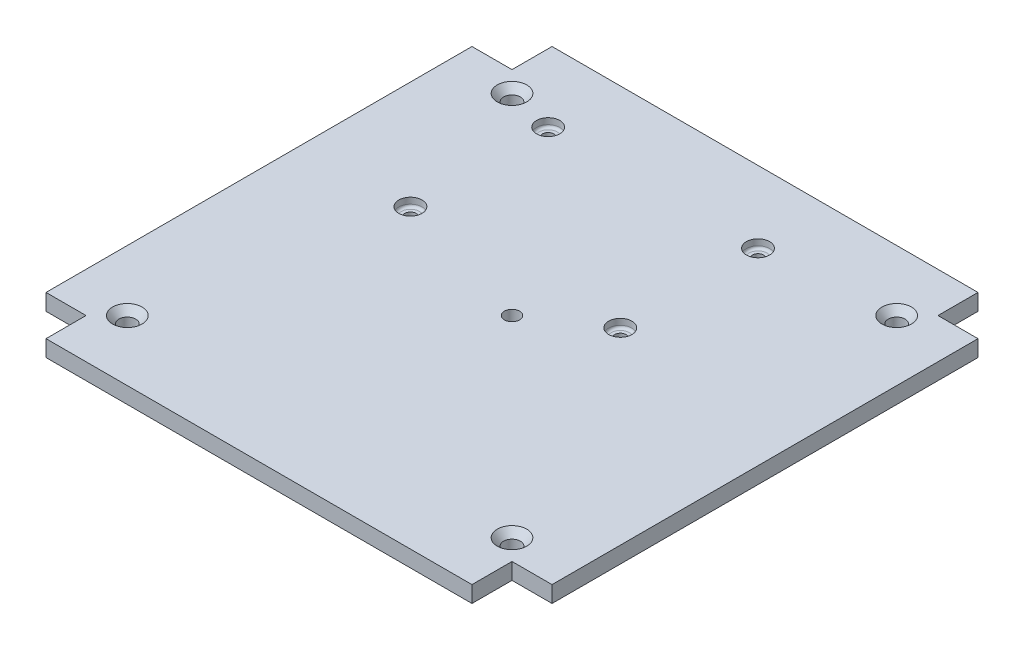
ISO-10303-21;
HEADER;
FILE_DESCRIPTION(('STEP AP214'),'2;1');
FILE_NAME('part.step','',(''),(''),'','','');
FILE_SCHEMA(('AUTOMOTIVE_DESIGN { 1 0 10303 214 1 1 1 1 }'));
ENDSEC;
DATA;
#1=APPLICATION_CONTEXT('core data for automotive mechanical design processes');
#2=APPLICATION_PROTOCOL_DEFINITION('international standard','automotive_design',2000,#1);
#3=PRODUCT_CONTEXT('',#1,'mechanical');
#4=PRODUCT('Part','Part','',(#3));
#5=PRODUCT_RELATED_PRODUCT_CATEGORY('part','',(#4));
#6=PRODUCT_DEFINITION_FORMATION('','',#4);
#7=PRODUCT_DEFINITION_CONTEXT('part definition',#1,'design');
#8=PRODUCT_DEFINITION('design','',#6,#7);
#9=PRODUCT_DEFINITION_SHAPE('','',#8);
#10=(LENGTH_UNIT() NAMED_UNIT(*) SI_UNIT(.MILLI.,.METRE.));
#11=(NAMED_UNIT(*) PLANE_ANGLE_UNIT() SI_UNIT($,.RADIAN.));
#12=(NAMED_UNIT(*) SI_UNIT($,.STERADIAN.) SOLID_ANGLE_UNIT());
#13=UNCERTAINTY_MEASURE_WITH_UNIT(LENGTH_MEASURE(1.E-05),#10,'distance_accuracy_value','');
#14=(GEOMETRIC_REPRESENTATION_CONTEXT(3) GLOBAL_UNCERTAINTY_ASSIGNED_CONTEXT((#13)) GLOBAL_UNIT_ASSIGNED_CONTEXT((#10,
#11,#12)) REPRESENTATION_CONTEXT('',''));
#15=CARTESIAN_POINT('',(0.,0.,0.));
#16=DIRECTION('',(0.,0.,1.));
#17=DIRECTION('',(1.,0.,0.));
#18=AXIS2_PLACEMENT_3D('',#15,#16,#17);
#19=CARTESIAN_POINT('',(49.,3.175,49.));
#20=DIRECTION('',(-1.,0.,0.));
#21=DIRECTION('',(0.,0.,1.));
#22=AXIS2_PLACEMENT_3D('',#19,#20,#21);
#23=PLANE('',#22);
#24=DIRECTION('',(0.,0.,-1.));
#25=VECTOR('',#24,1.);
#26=CARTESIAN_POINT('',(49.,0.,49.));
#27=LINE('',#26,#25);
#28=CARTESIAN_POINT('',(49.,0.,41.246));
#29=VERTEX_POINT('',#28);
#30=CARTESIAN_POINT('',(49.,0.,-41.246));
#31=VERTEX_POINT('',#30);
#32=EDGE_CURVE('E156',#29,#31,#27,.T.);
#33=ORIENTED_EDGE('',*,*,#32,.T.);
#34=DIRECTION('',(0.,1.,0.));
#35=VECTOR('',#34,1.);
#36=CARTESIAN_POINT('',(49.,0.,-41.246));
#37=LINE('',#36,#35);
#38=CARTESIAN_POINT('',(49.,3.175,-41.246));
#39=VERTEX_POINT('',#38);
#40=EDGE_CURVE('E673',#31,#39,#37,.T.);
#41=ORIENTED_EDGE('',*,*,#40,.T.);
#42=DIRECTION('',(0.,0.,-1.));
#43=VECTOR('',#42,1.);
#44=CARTESIAN_POINT('',(49.,3.175,49.));
#45=LINE('',#44,#43);
#46=CARTESIAN_POINT('',(49.,3.175,41.246));
#47=VERTEX_POINT('',#46);
#48=EDGE_CURVE('E168',#47,#39,#45,.T.);
#49=ORIENTED_EDGE('',*,*,#48,.F.);
#50=DIRECTION('',(0.,1.,0.));
#51=VECTOR('',#50,1.);
#52=CARTESIAN_POINT('',(49.,0.,41.246));
#53=LINE('',#52,#51);
#54=EDGE_CURVE('E307',#29,#47,#53,.T.);
#55=ORIENTED_EDGE('',*,*,#54,.F.);
#56=EDGE_LOOP('',(#33,#41,#49,#55));
#57=FACE_BOUND('',#56,.T.);
#58=ADVANCED_FACE('F43',(#57),#23,.F.);
#59=CARTESIAN_POINT('',(-49.,3.175,-49.));
#60=DIRECTION('',(0.,0.,1.));
#61=DIRECTION('',(1.,0.,0.));
#62=AXIS2_PLACEMENT_3D('',#59,#60,#61);
#63=PLANE('',#62);
#64=DIRECTION('',(-1.,0.,0.));
#65=VECTOR('',#64,1.);
#66=CARTESIAN_POINT('',(-49.,3.175,-49.));
#67=LINE('',#66,#65);
#68=CARTESIAN_POINT('',(41.246,3.175,-49.));
#69=VERTEX_POINT('',#68);
#70=CARTESIAN_POINT('',(-41.246,3.175,-49.));
#71=VERTEX_POINT('',#70);
#72=EDGE_CURVE('E148',#69,#71,#67,.T.);
#73=ORIENTED_EDGE('',*,*,#72,.F.);
#74=DIRECTION('',(0.,1.,0.));
#75=VECTOR('',#74,1.);
#76=CARTESIAN_POINT('',(41.246,0.,-49.));
#77=LINE('',#76,#75);
#78=CARTESIAN_POINT('',(41.246,0.,-49.));
#79=VERTEX_POINT('',#78);
#80=EDGE_CURVE('E135',#79,#69,#77,.T.);
#81=ORIENTED_EDGE('',*,*,#80,.F.);
#82=DIRECTION('',(-1.,0.,0.));
#83=VECTOR('',#82,1.);
#84=CARTESIAN_POINT('',(-49.,0.,-49.));
#85=LINE('',#84,#83);
#86=CARTESIAN_POINT('',(-41.246,0.,-49.));
#87=VERTEX_POINT('',#86);
#88=EDGE_CURVE('E146',#79,#87,#85,.T.);
#89=ORIENTED_EDGE('',*,*,#88,.T.);
#90=DIRECTION('',(0.,1.,0.));
#91=VECTOR('',#90,1.);
#92=CARTESIAN_POINT('',(-41.246,0.,-49.));
#93=LINE('',#92,#91);
#94=EDGE_CURVE('E336',#87,#71,#93,.T.);
#95=ORIENTED_EDGE('',*,*,#94,.T.);
#96=EDGE_LOOP('',(#73,#81,#89,#95));
#97=FACE_BOUND('',#96,.T.);
#98=ADVANCED_FACE('F144',(#97),#63,.F.);
#99=CARTESIAN_POINT('',(-49.,3.175,49.));
#100=DIRECTION('',(1.,0.,0.));
#101=DIRECTION('',(0.,0.,-1.));
#102=AXIS2_PLACEMENT_3D('',#99,#100,#101);
#103=PLANE('',#102);
#104=DIRECTION('',(0.,0.,1.));
#105=VECTOR('',#104,1.);
#106=CARTESIAN_POINT('',(-49.,0.,49.));
#107=LINE('',#106,#105);
#108=CARTESIAN_POINT('',(-49.,0.,-41.246));
#109=VERTEX_POINT('',#108);
#110=CARTESIAN_POINT('',(-49.,0.,41.246));
#111=VERTEX_POINT('',#110);
#112=EDGE_CURVE('E155',#109,#111,#107,.T.);
#113=ORIENTED_EDGE('',*,*,#112,.T.);
#114=DIRECTION('',(0.,1.,0.));
#115=VECTOR('',#114,1.);
#116=CARTESIAN_POINT('',(-49.,0.,41.246));
#117=LINE('',#116,#115);
#118=CARTESIAN_POINT('',(-49.,3.175,41.246));
#119=VERTEX_POINT('',#118);
#120=EDGE_CURVE('E320',#111,#119,#117,.T.);
#121=ORIENTED_EDGE('',*,*,#120,.T.);
#122=DIRECTION('',(0.,0.,1.));
#123=VECTOR('',#122,1.);
#124=CARTESIAN_POINT('',(-49.,3.175,49.));
#125=LINE('',#124,#123);
#126=CARTESIAN_POINT('',(-49.,3.175,-41.246));
#127=VERTEX_POINT('',#126);
#128=EDGE_CURVE('E283',#127,#119,#125,.T.);
#129=ORIENTED_EDGE('',*,*,#128,.F.);
#130=DIRECTION('',(0.,1.,0.));
#131=VECTOR('',#130,1.);
#132=CARTESIAN_POINT('',(-49.,0.,-41.246));
#133=LINE('',#132,#131);
#134=EDGE_CURVE('E331',#109,#127,#133,.T.);
#135=ORIENTED_EDGE('',*,*,#134,.F.);
#136=EDGE_LOOP('',(#113,#121,#129,#135));
#137=FACE_BOUND('',#136,.T.);
#138=ADVANCED_FACE('F229',(#137),#103,.F.);
#139=CARTESIAN_POINT('',(-49.,3.175,49.));
#140=DIRECTION('',(0.,0.,-1.));
#141=DIRECTION('',(-1.,0.,0.));
#142=AXIS2_PLACEMENT_3D('',#139,#140,#141);
#143=PLANE('',#142);
#144=DIRECTION('',(1.,0.,0.));
#145=VECTOR('',#144,1.);
#146=CARTESIAN_POINT('',(-49.,0.,49.));
#147=LINE('',#146,#145);
#148=CARTESIAN_POINT('',(-41.246,0.,49.));
#149=VERTEX_POINT('',#148);
#150=CARTESIAN_POINT('',(41.246,0.,49.));
#151=VERTEX_POINT('',#150);
#152=EDGE_CURVE('E159',#149,#151,#147,.T.);
#153=ORIENTED_EDGE('',*,*,#152,.T.);
#154=DIRECTION('',(0.,1.,0.));
#155=VECTOR('',#154,1.);
#156=CARTESIAN_POINT('',(41.246,0.,49.));
#157=LINE('',#156,#155);
#158=CARTESIAN_POINT('',(41.246,3.175,49.));
#159=VERTEX_POINT('',#158);
#160=EDGE_CURVE('E302',#151,#159,#157,.T.);
#161=ORIENTED_EDGE('',*,*,#160,.T.);
#162=DIRECTION('',(1.,0.,0.));
#163=VECTOR('',#162,1.);
#164=CARTESIAN_POINT('',(-49.,3.175,49.));
#165=LINE('',#164,#163);
#166=CARTESIAN_POINT('',(-41.246,3.175,49.));
#167=VERTEX_POINT('',#166);
#168=EDGE_CURVE('E192',#167,#159,#165,.T.);
#169=ORIENTED_EDGE('',*,*,#168,.F.);
#170=DIRECTION('',(0.,1.,0.));
#171=VECTOR('',#170,1.);
#172=CARTESIAN_POINT('',(-41.246,0.,49.));
#173=LINE('',#172,#171);
#174=EDGE_CURVE('E300',#149,#167,#173,.T.);
#175=ORIENTED_EDGE('',*,*,#174,.F.);
#176=EDGE_LOOP('',(#153,#161,#169,#175));
#177=FACE_BOUND('',#176,.T.);
#178=ADVANCED_FACE('F299',(#177),#143,.F.);
#179=CARTESIAN_POINT('',(0.,3.175,0.));
#180=DIRECTION('',(0.,-1.,0.));
#181=DIRECTION('',(0.,0.,-1.));
#182=AXIS2_PLACEMENT_3D('',#179,#180,#181);
#183=PLANE('',#182);
#184=CARTESIAN_POINT('',(-28.095,3.175,-8.425));
#185=DIRECTION('',(0.,1.,0.));
#186=DIRECTION('',(0.,0.,1.));
#187=AXIS2_PLACEMENT_3D('',#184,#185,#186);
#188=CIRCLE('',#187,2.25);
#189=CARTESIAN_POINT('',(-28.095,3.175,-6.175));
#190=VERTEX_POINT('',#189);
#191=EDGE_CURVE('E186',#190,#190,#188,.T.);
#192=ORIENTED_EDGE('',*,*,#191,.F.);
#193=EDGE_LOOP('',(#192));
#194=FACE_BOUND('',#193,.T.);
#195=CARTESIAN_POINT('',(12.545,3.175,-8.425));
#196=DIRECTION('',(0.,1.,0.));
#197=DIRECTION('',(0.,0.,1.));
#198=AXIS2_PLACEMENT_3D('',#195,#196,#197);
#199=CIRCLE('',#198,2.25);
#200=CARTESIAN_POINT('',(12.545,3.175,-6.175));
#201=VERTEX_POINT('',#200);
#202=EDGE_CURVE('E181',#201,#201,#199,.T.);
#203=ORIENTED_EDGE('',*,*,#202,.F.);
#204=EDGE_LOOP('',(#203));
#205=FACE_BOUND('',#204,.T.);
#206=CARTESIAN_POINT('',(12.545,3.175,-35.095));
#207=DIRECTION('',(0.,1.,0.));
#208=DIRECTION('',(0.,0.,1.));
#209=AXIS2_PLACEMENT_3D('',#206,#207,#208);
#210=CIRCLE('',#209,2.25);
#211=CARTESIAN_POINT('',(12.545,3.175,-32.845));
#212=VERTEX_POINT('',#211);
#213=EDGE_CURVE('E177',#212,#212,#210,.T.);
#214=ORIENTED_EDGE('',*,*,#213,.F.);
#215=EDGE_LOOP('',(#214));
#216=FACE_BOUND('',#215,.T.);
#217=CARTESIAN_POINT('',(-28.095,3.175,-35.095));
#218=DIRECTION('',(0.,1.,0.));
#219=DIRECTION('',(0.,0.,1.));
#220=AXIS2_PLACEMENT_3D('',#217,#218,#219);
#221=CIRCLE('',#220,2.25);
#222=CARTESIAN_POINT('',(-28.095,3.175,-32.845));
#223=VERTEX_POINT('',#222);
#224=EDGE_CURVE('E173',#223,#223,#221,.T.);
#225=ORIENTED_EDGE('',*,*,#224,.F.);
#226=EDGE_LOOP('',(#225));
#227=FACE_BOUND('',#226,.T.);
#228=CARTESIAN_POINT('',(37.2500000000016,3.175,37.250000000002));
#229=DIRECTION('',(0.,1.,0.));
#230=DIRECTION('',(0.,0.,1.));
#231=AXIS2_PLACEMENT_3D('',#228,#229,#230);
#232=CIRCLE('',#231,2.8575);
#233=CARTESIAN_POINT('',(37.2500000000016,3.175,40.107500000002));
#234=VERTEX_POINT('',#233);
#235=EDGE_CURVE('E338',#234,#234,#232,.T.);
#236=ORIENTED_EDGE('',*,*,#235,.F.);
#237=EDGE_LOOP('',(#236));
#238=FACE_BOUND('',#237,.T.);
#239=CARTESIAN_POINT('',(-37.2499999999981,3.175,37.2500000000024));
#240=DIRECTION('',(0.,1.,0.));
#241=DIRECTION('',(0.,0.,1.));
#242=AXIS2_PLACEMENT_3D('',#239,#240,#241);
#243=CIRCLE('',#242,2.8575);
#244=CARTESIAN_POINT('',(-37.2499999999981,3.175,40.1075000000024));
#245=VERTEX_POINT('',#244);
#246=EDGE_CURVE('E350',#245,#245,#243,.T.);
#247=ORIENTED_EDGE('',*,*,#246,.F.);
#248=EDGE_LOOP('',(#247));
#249=FACE_BOUND('',#248,.T.);
#250=CARTESIAN_POINT('',(-37.2499999999987,3.175,-37.2499999999978));
#251=DIRECTION('',(0.,1.,0.));
#252=DIRECTION('',(0.,0.,1.));
#253=AXIS2_PLACEMENT_3D('',#250,#251,#252);
#254=CIRCLE('',#253,2.8575);
#255=CARTESIAN_POINT('',(-37.2499999999987,3.175,-34.3924999999978));
#256=VERTEX_POINT('',#255);
#257=EDGE_CURVE('E359',#256,#256,#254,.T.);
#258=ORIENTED_EDGE('',*,*,#257,.F.);
#259=EDGE_LOOP('',(#258));
#260=FACE_BOUND('',#259,.T.);
#261=CARTESIAN_POINT('',(37.2499999999997,3.175,-37.2499999999999));
#262=DIRECTION('',(0.,1.,0.));
#263=DIRECTION('',(0.,0.,1.));
#264=AXIS2_PLACEMENT_3D('',#261,#262,#263);
#265=CIRCLE('',#264,2.8575);
#266=CARTESIAN_POINT('',(37.2499999999997,3.175,-34.3924999999999));
#267=VERTEX_POINT('',#266);
#268=EDGE_CURVE('E368',#267,#267,#265,.T.);
#269=ORIENTED_EDGE('',*,*,#268,.F.);
#270=EDGE_LOOP('',(#269));
#271=FACE_BOUND('',#270,.T.);
#272=CARTESIAN_POINT('',(0.,3.175,0.));
#273=DIRECTION('',(0.,1.,0.));
#274=DIRECTION('',(0.,0.,1.));
#275=AXIS2_PLACEMENT_3D('',#272,#273,#274);
#276=CIRCLE('',#275,1.47319999999999);
#277=CARTESIAN_POINT('',(0.,3.175,1.47319999999999));
#278=VERTEX_POINT('',#277);
#279=EDGE_CURVE('E269',#278,#278,#276,.T.);
#280=ORIENTED_EDGE('',*,*,#279,.F.);
#281=EDGE_LOOP('',(#280));
#282=FACE_BOUND('',#281,.T.);
#283=ORIENTED_EDGE('',*,*,#48,.T.);
#284=DIRECTION('',(1.,0.,0.));
#285=VECTOR('',#284,1.);
#286=CARTESIAN_POINT('',(49.,3.175,-41.246));
#287=LINE('',#286,#285);
#288=CARTESIAN_POINT('',(41.246,3.175,-41.246));
#289=VERTEX_POINT('',#288);
#290=EDGE_CURVE('E140',#289,#39,#287,.T.);
#291=ORIENTED_EDGE('',*,*,#290,.F.);
#292=DIRECTION('',(0.,0.,1.));
#293=VECTOR('',#292,1.);
#294=CARTESIAN_POINT('',(41.246,3.175,-41.246));
#295=LINE('',#294,#293);
#296=EDGE_CURVE('E172',#69,#289,#295,.T.);
#297=ORIENTED_EDGE('',*,*,#296,.F.);
#298=ORIENTED_EDGE('',*,*,#72,.T.);
#299=DIRECTION('',(0.,0.,-1.));
#300=VECTOR('',#299,1.);
#301=CARTESIAN_POINT('',(-41.246,3.175,-49.));
#302=LINE('',#301,#300);
#303=CARTESIAN_POINT('',(-41.246,3.175,-41.246));
#304=VERTEX_POINT('',#303);
#305=EDGE_CURVE('E329',#304,#71,#302,.T.);
#306=ORIENTED_EDGE('',*,*,#305,.F.);
#307=DIRECTION('',(1.,0.,0.));
#308=VECTOR('',#307,1.);
#309=CARTESIAN_POINT('',(-41.246,3.175,-41.246));
#310=LINE('',#309,#308);
#311=EDGE_CURVE('E323',#127,#304,#310,.T.);
#312=ORIENTED_EDGE('',*,*,#311,.F.);
#313=ORIENTED_EDGE('',*,*,#128,.T.);
#314=DIRECTION('',(-1.,0.,0.));
#315=VECTOR('',#314,1.);
#316=CARTESIAN_POINT('',(-49.,3.175,41.246));
#317=LINE('',#316,#315);
#318=CARTESIAN_POINT('',(-41.246,3.175,41.246));
#319=VERTEX_POINT('',#318);
#320=EDGE_CURVE('E305',#319,#119,#317,.T.);
#321=ORIENTED_EDGE('',*,*,#320,.F.);
#322=DIRECTION('',(0.,0.,-1.));
#323=VECTOR('',#322,1.);
#324=CARTESIAN_POINT('',(-41.246,3.175,41.246));
#325=LINE('',#324,#323);
#326=EDGE_CURVE('E295',#167,#319,#325,.T.);
#327=ORIENTED_EDGE('',*,*,#326,.F.);
#328=ORIENTED_EDGE('',*,*,#168,.T.);
#329=DIRECTION('',(0.,0.,1.));
#330=VECTOR('',#329,1.);
#331=CARTESIAN_POINT('',(41.246,3.175,49.));
#332=LINE('',#331,#330);
#333=CARTESIAN_POINT('',(41.246,3.175,41.246));
#334=VERTEX_POINT('',#333);
#335=EDGE_CURVE('E292',#334,#159,#332,.T.);
#336=ORIENTED_EDGE('',*,*,#335,.F.);
#337=DIRECTION('',(-1.,0.,0.));
#338=VECTOR('',#337,1.);
#339=CARTESIAN_POINT('',(41.246,3.175,41.246));
#340=LINE('',#339,#338);
#341=EDGE_CURVE('E676',#47,#334,#340,.T.);
#342=ORIENTED_EDGE('',*,*,#341,.F.);
#343=EDGE_LOOP('',(#283,#291,#297,#298,#306,#312,#313,#321,#327,#328,#336,#342));
#344=FACE_BOUND('',#343,.T.);
#345=ADVANCED_FACE('F290',(#194,#205,#216,#227,#238,#249,#260,#271,#282,#344),#183,.F.);
#346=CARTESIAN_POINT('',(0.,0.,0.));
#347=DIRECTION('',(0.,-1.,0.));
#348=DIRECTION('',(0.,0.,-1.));
#349=AXIS2_PLACEMENT_3D('',#346,#347,#348);
#350=PLANE('',#349);
#351=DIRECTION('',(1.,0.,0.));
#352=VECTOR('',#351,1.);
#353=CARTESIAN_POINT('',(49.,0.,-41.246));
#354=LINE('',#353,#352);
#355=CARTESIAN_POINT('',(41.246,0.,-41.246));
#356=VERTEX_POINT('',#355);
#357=EDGE_CURVE('E58',#356,#31,#354,.T.);
#358=ORIENTED_EDGE('',*,*,#357,.T.);
#359=ORIENTED_EDGE('',*,*,#32,.F.);
#360=DIRECTION('',(-1.,0.,0.));
#361=VECTOR('',#360,1.);
#362=CARTESIAN_POINT('',(41.246,0.,41.246));
#363=LINE('',#362,#361);
#364=CARTESIAN_POINT('',(41.246,0.,41.246));
#365=VERTEX_POINT('',#364);
#366=EDGE_CURVE('E678',#29,#365,#363,.T.);
#367=ORIENTED_EDGE('',*,*,#366,.T.);
#368=DIRECTION('',(0.,0.,1.));
#369=VECTOR('',#368,1.);
#370=CARTESIAN_POINT('',(41.246,0.,49.));
#371=LINE('',#370,#369);
#372=EDGE_CURVE('E66',#365,#151,#371,.T.);
#373=ORIENTED_EDGE('',*,*,#372,.T.);
#374=ORIENTED_EDGE('',*,*,#152,.F.);
#375=DIRECTION('',(0.,0.,-1.));
#376=VECTOR('',#375,1.);
#377=CARTESIAN_POINT('',(-41.246,0.,41.246));
#378=LINE('',#377,#376);
#379=CARTESIAN_POINT('',(-41.246,0.,41.246));
#380=VERTEX_POINT('',#379);
#381=EDGE_CURVE('E313',#149,#380,#378,.T.);
#382=ORIENTED_EDGE('',*,*,#381,.T.);
#383=DIRECTION('',(-1.,0.,0.));
#384=VECTOR('',#383,1.);
#385=CARTESIAN_POINT('',(-49.,0.,41.246));
#386=LINE('',#385,#384);
#387=EDGE_CURVE('E316',#380,#111,#386,.T.);
#388=ORIENTED_EDGE('',*,*,#387,.T.);
#389=ORIENTED_EDGE('',*,*,#112,.F.);
#390=DIRECTION('',(1.,0.,0.));
#391=VECTOR('',#390,1.);
#392=CARTESIAN_POINT('',(-41.246,0.,-41.246));
#393=LINE('',#392,#391);
#394=CARTESIAN_POINT('',(-41.246,0.,-41.246));
#395=VERTEX_POINT('',#394);
#396=EDGE_CURVE('E327',#109,#395,#393,.T.);
#397=ORIENTED_EDGE('',*,*,#396,.T.);
#398=DIRECTION('',(0.,0.,-1.));
#399=VECTOR('',#398,1.);
#400=CARTESIAN_POINT('',(-41.246,0.,-49.));
#401=LINE('',#400,#399);
#402=EDGE_CURVE('E154',#395,#87,#401,.T.);
#403=ORIENTED_EDGE('',*,*,#402,.T.);
#404=ORIENTED_EDGE('',*,*,#88,.F.);
#405=DIRECTION('',(0.,0.,1.));
#406=VECTOR('',#405,1.);
#407=CARTESIAN_POINT('',(41.246,0.,-41.246));
#408=LINE('',#407,#406);
#409=EDGE_CURVE('E131',#79,#356,#408,.T.);
#410=ORIENTED_EDGE('',*,*,#409,.T.);
#411=EDGE_LOOP('',(#358,#359,#367,#373,#374,#382,#388,#389,#397,#403,#404,#410));
#412=FACE_BOUND('',#411,.T.);
#413=CARTESIAN_POINT('',(37.2500000000016,0.,37.250000000002));
#414=DIRECTION('',(0.,1.,0.));
#415=DIRECTION('',(0.,0.,1.));
#416=AXIS2_PLACEMENT_3D('',#413,#414,#415);
#417=CIRCLE('',#416,1.63195);
#418=CARTESIAN_POINT('',(37.2500000000016,0.,38.881950000002));
#419=VERTEX_POINT('',#418);
#420=EDGE_CURVE('E347',#419,#419,#417,.T.);
#421=ORIENTED_EDGE('',*,*,#420,.T.);
#422=EDGE_LOOP('',(#421));
#423=FACE_BOUND('',#422,.T.);
#424=CARTESIAN_POINT('',(-37.2499999999981,0.,37.2500000000024));
#425=DIRECTION('',(0.,1.,0.));
#426=DIRECTION('',(0.,0.,1.));
#427=AXIS2_PLACEMENT_3D('',#424,#425,#426);
#428=CIRCLE('',#427,1.63195);
#429=CARTESIAN_POINT('',(-37.2499999999981,0.,38.8819500000024));
#430=VERTEX_POINT('',#429);
#431=EDGE_CURVE('E356',#430,#430,#428,.T.);
#432=ORIENTED_EDGE('',*,*,#431,.T.);
#433=EDGE_LOOP('',(#432));
#434=FACE_BOUND('',#433,.T.);
#435=CARTESIAN_POINT('',(-37.2499999999987,0.,-37.2499999999978));
#436=DIRECTION('',(0.,1.,0.));
#437=DIRECTION('',(0.,0.,1.));
#438=AXIS2_PLACEMENT_3D('',#435,#436,#437);
#439=CIRCLE('',#438,1.63195);
#440=CARTESIAN_POINT('',(-37.2499999999987,0.,-35.6180499999978));
#441=VERTEX_POINT('',#440);
#442=EDGE_CURVE('E365',#441,#441,#439,.T.);
#443=ORIENTED_EDGE('',*,*,#442,.T.);
#444=EDGE_LOOP('',(#443));
#445=FACE_BOUND('',#444,.T.);
#446=CARTESIAN_POINT('',(37.2499999999997,0.,-37.2499999999999));
#447=DIRECTION('',(0.,1.,0.));
#448=DIRECTION('',(0.,0.,1.));
#449=AXIS2_PLACEMENT_3D('',#446,#447,#448);
#450=CIRCLE('',#449,1.63195);
#451=CARTESIAN_POINT('',(37.2499999999997,0.,-35.6180499999999));
#452=VERTEX_POINT('',#451);
#453=EDGE_CURVE('E374',#452,#452,#450,.T.);
#454=ORIENTED_EDGE('',*,*,#453,.T.);
#455=EDGE_LOOP('',(#454));
#456=FACE_BOUND('',#455,.T.);
#457=CARTESIAN_POINT('',(-28.095,0.,-35.095));
#458=DIRECTION('',(0.,1.,0.));
#459=DIRECTION('',(0.,0.,1.));
#460=AXIS2_PLACEMENT_3D('',#457,#458,#459);
#461=CIRCLE('',#460,1.1);
#462=CARTESIAN_POINT('',(-28.095,0.,-33.995));
#463=VERTEX_POINT('',#462);
#464=EDGE_CURVE('E272',#463,#463,#461,.T.);
#465=ORIENTED_EDGE('',*,*,#464,.T.);
#466=EDGE_LOOP('',(#465));
#467=FACE_BOUND('',#466,.T.);
#468=CARTESIAN_POINT('',(12.545,0.,-35.095));
#469=DIRECTION('',(0.,1.,0.));
#470=DIRECTION('',(0.,0.,1.));
#471=AXIS2_PLACEMENT_3D('',#468,#469,#470);
#472=CIRCLE('',#471,1.1);
#473=CARTESIAN_POINT('',(12.545,0.,-33.995));
#474=VERTEX_POINT('',#473);
#475=EDGE_CURVE('E265',#474,#474,#472,.T.);
#476=ORIENTED_EDGE('',*,*,#475,.T.);
#477=EDGE_LOOP('',(#476));
#478=FACE_BOUND('',#477,.T.);
#479=CARTESIAN_POINT('',(12.545,0.,-8.425));
#480=DIRECTION('',(0.,1.,0.));
#481=DIRECTION('',(0.,0.,1.));
#482=AXIS2_PLACEMENT_3D('',#479,#480,#481);
#483=CIRCLE('',#482,1.1);
#484=CARTESIAN_POINT('',(12.545,0.,-7.325));
#485=VERTEX_POINT('',#484);
#486=EDGE_CURVE('E262',#485,#485,#483,.T.);
#487=ORIENTED_EDGE('',*,*,#486,.T.);
#488=EDGE_LOOP('',(#487));
#489=FACE_BOUND('',#488,.T.);
#490=CARTESIAN_POINT('',(-28.095,0.,-8.425));
#491=DIRECTION('',(0.,1.,0.));
#492=DIRECTION('',(0.,0.,1.));
#493=AXIS2_PLACEMENT_3D('',#490,#491,#492);
#494=CIRCLE('',#493,1.1);
#495=CARTESIAN_POINT('',(-28.095,0.,-7.325));
#496=VERTEX_POINT('',#495);
#497=EDGE_CURVE('E264',#496,#496,#494,.T.);
#498=ORIENTED_EDGE('',*,*,#497,.T.);
#499=EDGE_LOOP('',(#498));
#500=FACE_BOUND('',#499,.T.);
#501=CARTESIAN_POINT('',(0.,0.,0.));
#502=DIRECTION('',(0.,1.,0.));
#503=DIRECTION('',(0.,0.,1.));
#504=AXIS2_PLACEMENT_3D('',#501,#502,#503);
#505=CIRCLE('',#504,1.4732);
#506=CARTESIAN_POINT('',(0.,0.,1.4732));
#507=VERTEX_POINT('',#506);
#508=EDGE_CURVE('E162',#507,#507,#505,.T.);
#509=ORIENTED_EDGE('',*,*,#508,.T.);
#510=EDGE_LOOP('',(#509));
#511=FACE_BOUND('',#510,.T.);
#512=ADVANCED_FACE('F151',(#412,#423,#434,#445,#456,#467,#478,#489,#500,#511),#350,.T.);
#513=CARTESIAN_POINT('',(0.,3.175,0.));
#514=DIRECTION('',(0.,1.,0.));
#515=DIRECTION('',(0.,0.,1.));
#516=AXIS2_PLACEMENT_3D('',#513,#514,#515);
#517=CYLINDRICAL_SURFACE('',#516,1.47319999999999);
#518=ORIENTED_EDGE('',*,*,#508,.F.);
#519=EDGE_LOOP('',(#518));
#520=FACE_BOUND('',#519,.T.);
#521=ORIENTED_EDGE('',*,*,#279,.T.);
#522=EDGE_LOOP('',(#521));
#523=FACE_BOUND('',#522,.T.);
#524=ADVANCED_FACE('F400',(#520,#523),#517,.F.);
#525=CARTESIAN_POINT('',(-28.095,3.175,-8.425));
#526=DIRECTION('',(0.,1.,0.));
#527=DIRECTION('',(0.,0.,1.));
#528=AXIS2_PLACEMENT_3D('',#525,#526,#527);
#529=CYLINDRICAL_SURFACE('',#528,1.1);
#530=CARTESIAN_POINT('',(-28.095,1.5,-8.425));
#531=DIRECTION('',(0.,-1.,0.));
#532=DIRECTION('',(0.,0.,-1.));
#533=AXIS2_PLACEMENT_3D('',#530,#531,#532);
#534=CIRCLE('',#533,1.1);
#535=CARTESIAN_POINT('',(-28.095,1.5,-9.525));
#536=VERTEX_POINT('',#535);
#537=EDGE_CURVE('E182',#536,#536,#534,.F.);
#538=ORIENTED_EDGE('',*,*,#537,.T.);
#539=EDGE_LOOP('',(#538));
#540=FACE_BOUND('',#539,.T.);
#541=ORIENTED_EDGE('',*,*,#497,.F.);
#542=EDGE_LOOP('',(#541));
#543=FACE_BOUND('',#542,.T.);
#544=ADVANCED_FACE('F258',(#540,#543),#529,.F.);
#545=CARTESIAN_POINT('',(12.545,3.175,-8.425));
#546=DIRECTION('',(0.,1.,0.));
#547=DIRECTION('',(0.,0.,1.));
#548=AXIS2_PLACEMENT_3D('',#545,#546,#547);
#549=CYLINDRICAL_SURFACE('',#548,1.1);
#550=CARTESIAN_POINT('',(12.545,1.5,-8.425));
#551=DIRECTION('',(0.,-1.,0.));
#552=DIRECTION('',(0.,0.,-1.));
#553=AXIS2_PLACEMENT_3D('',#550,#551,#552);
#554=CIRCLE('',#553,1.1);
#555=CARTESIAN_POINT('',(12.545,1.5,-9.525));
#556=VERTEX_POINT('',#555);
#557=EDGE_CURVE('E178',#556,#556,#554,.F.);
#558=ORIENTED_EDGE('',*,*,#557,.T.);
#559=EDGE_LOOP('',(#558));
#560=FACE_BOUND('',#559,.T.);
#561=ORIENTED_EDGE('',*,*,#486,.F.);
#562=EDGE_LOOP('',(#561));
#563=FACE_BOUND('',#562,.T.);
#564=ADVANCED_FACE('F254',(#560,#563),#549,.F.);
#565=CARTESIAN_POINT('',(12.545,3.175,-35.095));
#566=DIRECTION('',(0.,1.,0.));
#567=DIRECTION('',(0.,0.,1.));
#568=AXIS2_PLACEMENT_3D('',#565,#566,#567);
#569=CYLINDRICAL_SURFACE('',#568,1.1);
#570=CARTESIAN_POINT('',(12.545,1.5,-35.095));
#571=DIRECTION('',(0.,-1.,0.));
#572=DIRECTION('',(0.,0.,-1.));
#573=AXIS2_PLACEMENT_3D('',#570,#571,#572);
#574=CIRCLE('',#573,1.1);
#575=CARTESIAN_POINT('',(12.545,1.5,-36.195));
#576=VERTEX_POINT('',#575);
#577=EDGE_CURVE('E174',#576,#576,#574,.F.);
#578=ORIENTED_EDGE('',*,*,#577,.T.);
#579=EDGE_LOOP('',(#578));
#580=FACE_BOUND('',#579,.T.);
#581=ORIENTED_EDGE('',*,*,#475,.F.);
#582=EDGE_LOOP('',(#581));
#583=FACE_BOUND('',#582,.T.);
#584=ADVANCED_FACE('F257',(#580,#583),#569,.F.);
#585=CARTESIAN_POINT('',(-28.095,3.175,-35.095));
#586=DIRECTION('',(0.,1.,0.));
#587=DIRECTION('',(0.,0.,1.));
#588=AXIS2_PLACEMENT_3D('',#585,#586,#587);
#589=CYLINDRICAL_SURFACE('',#588,1.1);
#590=CARTESIAN_POINT('',(-28.095,1.5,-35.095));
#591=DIRECTION('',(0.,-1.,0.));
#592=DIRECTION('',(0.,0.,-1.));
#593=AXIS2_PLACEMENT_3D('',#590,#591,#592);
#594=CIRCLE('',#593,1.1);
#595=CARTESIAN_POINT('',(-28.095,1.5,-36.195));
#596=VERTEX_POINT('',#595);
#597=EDGE_CURVE('E169',#596,#596,#594,.F.);
#598=ORIENTED_EDGE('',*,*,#597,.T.);
#599=EDGE_LOOP('',(#598));
#600=FACE_BOUND('',#599,.T.);
#601=ORIENTED_EDGE('',*,*,#464,.F.);
#602=EDGE_LOOP('',(#601));
#603=FACE_BOUND('',#602,.T.);
#604=ADVANCED_FACE('F381',(#600,#603),#589,.F.);
#605=CARTESIAN_POINT('',(37.2499999999997,3.175,-37.2499999999999));
#606=DIRECTION('',(0.,1.,0.));
#607=DIRECTION('',(0.,0.,1.));
#608=AXIS2_PLACEMENT_3D('',#605,#606,#607);
#609=CYLINDRICAL_SURFACE('',#608,1.63194999999999);
#610=ORIENTED_EDGE('',*,*,#453,.F.);
#611=EDGE_LOOP('',(#610));
#612=FACE_BOUND('',#611,.T.);
#613=CARTESIAN_POINT('',(37.2499999999997,1.76516599853026,-37.2499999999999));
#614=DIRECTION('',(0.,1.,0.));
#615=DIRECTION('',(0.,0.,1.));
#616=AXIS2_PLACEMENT_3D('',#613,#614,#615);
#617=CIRCLE('',#616,1.63194999999999);
#618=CARTESIAN_POINT('',(37.2499999999997,1.76516599853026,-35.6180499999999));
#619=VERTEX_POINT('',#618);
#620=EDGE_CURVE('E371',#619,#619,#617,.T.);
#621=ORIENTED_EDGE('',*,*,#620,.T.);
#622=EDGE_LOOP('',(#621));
#623=FACE_BOUND('',#622,.T.);
#624=ADVANCED_FACE('F383',(#612,#623),#609,.F.);
#625=CARTESIAN_POINT('',(37.2499999999997,3.175,-37.2499999999999));
#626=DIRECTION('',(0.,1.,0.));
#627=DIRECTION('',(0.,0.,1.));
#628=AXIS2_PLACEMENT_3D('',#625,#626,#627);
#629=CONICAL_SURFACE('',#628,2.8575,0.715584993317669);
#630=ORIENTED_EDGE('',*,*,#620,.F.);
#631=EDGE_LOOP('',(#630));
#632=FACE_BOUND('',#631,.T.);
#633=ORIENTED_EDGE('',*,*,#268,.T.);
#634=EDGE_LOOP('',(#633));
#635=FACE_BOUND('',#634,.T.);
#636=ADVANCED_FACE('F391',(#632,#635),#629,.F.);
#637=CARTESIAN_POINT('',(-37.2499999999987,3.175,-37.2499999999978));
#638=DIRECTION('',(0.,1.,0.));
#639=DIRECTION('',(0.,0.,1.));
#640=AXIS2_PLACEMENT_3D('',#637,#638,#639);
#641=CYLINDRICAL_SURFACE('',#640,1.63194999999999);
#642=ORIENTED_EDGE('',*,*,#442,.F.);
#643=EDGE_LOOP('',(#642));
#644=FACE_BOUND('',#643,.T.);
#645=CARTESIAN_POINT('',(-37.2499999999987,1.76516599853026,-37.2499999999978));
#646=DIRECTION('',(0.,1.,0.));
#647=DIRECTION('',(0.,0.,1.));
#648=AXIS2_PLACEMENT_3D('',#645,#646,#647);
#649=CIRCLE('',#648,1.63194999999999);
#650=CARTESIAN_POINT('',(-37.2499999999987,1.76516599853026,-35.6180499999978));
#651=VERTEX_POINT('',#650);
#652=EDGE_CURVE('E362',#651,#651,#649,.T.);
#653=ORIENTED_EDGE('',*,*,#652,.T.);
#654=EDGE_LOOP('',(#653));
#655=FACE_BOUND('',#654,.T.);
#656=ADVANCED_FACE('F458',(#644,#655),#641,.F.);
#657=CARTESIAN_POINT('',(-37.2499999999987,3.175,-37.2499999999978));
#658=DIRECTION('',(0.,1.,0.));
#659=DIRECTION('',(0.,0.,1.));
#660=AXIS2_PLACEMENT_3D('',#657,#658,#659);
#661=CONICAL_SURFACE('',#660,2.8575,0.715584993317669);
#662=ORIENTED_EDGE('',*,*,#652,.F.);
#663=EDGE_LOOP('',(#662));
#664=FACE_BOUND('',#663,.T.);
#665=ORIENTED_EDGE('',*,*,#257,.T.);
#666=EDGE_LOOP('',(#665));
#667=FACE_BOUND('',#666,.T.);
#668=ADVANCED_FACE('F454',(#664,#667),#661,.F.);
#669=CARTESIAN_POINT('',(-37.2499999999981,3.175,37.2500000000024));
#670=DIRECTION('',(0.,1.,0.));
#671=DIRECTION('',(0.,0.,1.));
#672=AXIS2_PLACEMENT_3D('',#669,#670,#671);
#673=CYLINDRICAL_SURFACE('',#672,1.63194999999999);
#674=ORIENTED_EDGE('',*,*,#431,.F.);
#675=EDGE_LOOP('',(#674));
#676=FACE_BOUND('',#675,.T.);
#677=CARTESIAN_POINT('',(-37.2499999999981,1.76516599853026,37.2500000000024));
#678=DIRECTION('',(0.,1.,0.));
#679=DIRECTION('',(0.,0.,1.));
#680=AXIS2_PLACEMENT_3D('',#677,#678,#679);
#681=CIRCLE('',#680,1.63194999999999);
#682=CARTESIAN_POINT('',(-37.2499999999981,1.76516599853026,38.8819500000023));
#683=VERTEX_POINT('',#682);
#684=EDGE_CURVE('E353',#683,#683,#681,.T.);
#685=ORIENTED_EDGE('',*,*,#684,.T.);
#686=EDGE_LOOP('',(#685));
#687=FACE_BOUND('',#686,.T.);
#688=ADVANCED_FACE('F450',(#676,#687),#673,.F.);
#689=CARTESIAN_POINT('',(-37.2499999999981,3.175,37.2500000000024));
#690=DIRECTION('',(0.,1.,0.));
#691=DIRECTION('',(0.,0.,1.));
#692=AXIS2_PLACEMENT_3D('',#689,#690,#691);
#693=CONICAL_SURFACE('',#692,2.8575,0.715584993317669);
#694=ORIENTED_EDGE('',*,*,#684,.F.);
#695=EDGE_LOOP('',(#694));
#696=FACE_BOUND('',#695,.T.);
#697=ORIENTED_EDGE('',*,*,#246,.T.);
#698=EDGE_LOOP('',(#697));
#699=FACE_BOUND('',#698,.T.);
#700=ADVANCED_FACE('F446',(#696,#699),#693,.F.);
#701=CARTESIAN_POINT('',(37.2500000000016,3.175,37.250000000002));
#702=DIRECTION('',(0.,1.,0.));
#703=DIRECTION('',(0.,0.,1.));
#704=AXIS2_PLACEMENT_3D('',#701,#702,#703);
#705=CYLINDRICAL_SURFACE('',#704,1.63194999999999);
#706=ORIENTED_EDGE('',*,*,#420,.F.);
#707=EDGE_LOOP('',(#706));
#708=FACE_BOUND('',#707,.T.);
#709=CARTESIAN_POINT('',(37.2500000000016,1.76516599853026,37.250000000002));
#710=DIRECTION('',(0.,1.,0.));
#711=DIRECTION('',(0.,0.,1.));
#712=AXIS2_PLACEMENT_3D('',#709,#710,#711);
#713=CIRCLE('',#712,1.63194999999999);
#714=CARTESIAN_POINT('',(37.2500000000016,1.76516599853026,38.8819500000019));
#715=VERTEX_POINT('',#714);
#716=EDGE_CURVE('E344',#715,#715,#713,.T.);
#717=ORIENTED_EDGE('',*,*,#716,.T.);
#718=EDGE_LOOP('',(#717));
#719=FACE_BOUND('',#718,.T.);
#720=ADVANCED_FACE('F438',(#708,#719),#705,.F.);
#721=CARTESIAN_POINT('',(37.2500000000016,3.175,37.250000000002));
#722=DIRECTION('',(0.,1.,0.));
#723=DIRECTION('',(0.,0.,1.));
#724=AXIS2_PLACEMENT_3D('',#721,#722,#723);
#725=CONICAL_SURFACE('',#724,2.8575,0.715584993317669);
#726=ORIENTED_EDGE('',*,*,#716,.F.);
#727=EDGE_LOOP('',(#726));
#728=FACE_BOUND('',#727,.T.);
#729=ORIENTED_EDGE('',*,*,#235,.T.);
#730=EDGE_LOOP('',(#729));
#731=FACE_BOUND('',#730,.T.);
#732=ADVANCED_FACE('F431',(#728,#731),#725,.F.);
#733=CARTESIAN_POINT('',(-41.246,0.,-49.));
#734=DIRECTION('',(1.,0.,0.));
#735=DIRECTION('',(0.,0.,-1.));
#736=AXIS2_PLACEMENT_3D('',#733,#734,#735);
#737=PLANE('',#736);
#738=ORIENTED_EDGE('',*,*,#305,.T.);
#739=ORIENTED_EDGE('',*,*,#94,.F.);
#740=ORIENTED_EDGE('',*,*,#402,.F.);
#741=DIRECTION('',(0.,1.,0.));
#742=VECTOR('',#741,1.);
#743=CARTESIAN_POINT('',(-41.246,0.,-41.246));
#744=LINE('',#743,#742);
#745=EDGE_CURVE('E339',#395,#304,#744,.T.);
#746=ORIENTED_EDGE('',*,*,#745,.T.);
#747=EDGE_LOOP('',(#738,#739,#740,#746));
#748=FACE_BOUND('',#747,.T.);
#749=ADVANCED_FACE('F429',(#748),#737,.F.);
#750=CARTESIAN_POINT('',(-41.246,0.,-41.246));
#751=DIRECTION('',(0.,0.,1.));
#752=DIRECTION('',(1.,0.,0.));
#753=AXIS2_PLACEMENT_3D('',#750,#751,#752);
#754=PLANE('',#753);
#755=ORIENTED_EDGE('',*,*,#311,.T.);
#756=ORIENTED_EDGE('',*,*,#745,.F.);
#757=ORIENTED_EDGE('',*,*,#396,.F.);
#758=ORIENTED_EDGE('',*,*,#134,.T.);
#759=EDGE_LOOP('',(#755,#756,#757,#758));
#760=FACE_BOUND('',#759,.T.);
#761=ADVANCED_FACE('F427',(#760),#754,.F.);
#762=CARTESIAN_POINT('',(-49.,0.,41.246));
#763=DIRECTION('',(0.,0.,-1.));
#764=DIRECTION('',(-1.,0.,0.));
#765=AXIS2_PLACEMENT_3D('',#762,#763,#764);
#766=PLANE('',#765);
#767=ORIENTED_EDGE('',*,*,#320,.T.);
#768=ORIENTED_EDGE('',*,*,#120,.F.);
#769=ORIENTED_EDGE('',*,*,#387,.F.);
#770=DIRECTION('',(0.,1.,0.));
#771=VECTOR('',#770,1.);
#772=CARTESIAN_POINT('',(-41.246,0.,41.246));
#773=LINE('',#772,#771);
#774=EDGE_CURVE('E324',#380,#319,#773,.T.);
#775=ORIENTED_EDGE('',*,*,#774,.T.);
#776=EDGE_LOOP('',(#767,#768,#769,#775));
#777=FACE_BOUND('',#776,.T.);
#778=ADVANCED_FACE('F420',(#777),#766,.F.);
#779=CARTESIAN_POINT('',(-41.246,0.,41.246));
#780=DIRECTION('',(1.,0.,0.));
#781=DIRECTION('',(0.,0.,-1.));
#782=AXIS2_PLACEMENT_3D('',#779,#780,#781);
#783=PLANE('',#782);
#784=ORIENTED_EDGE('',*,*,#326,.T.);
#785=ORIENTED_EDGE('',*,*,#774,.F.);
#786=ORIENTED_EDGE('',*,*,#381,.F.);
#787=ORIENTED_EDGE('',*,*,#174,.T.);
#788=EDGE_LOOP('',(#784,#785,#786,#787));
#789=FACE_BOUND('',#788,.T.);
#790=ADVANCED_FACE('F422',(#789),#783,.F.);
#791=CARTESIAN_POINT('',(41.246,0.,49.));
#792=DIRECTION('',(-1.,0.,0.));
#793=DIRECTION('',(0.,0.,1.));
#794=AXIS2_PLACEMENT_3D('',#791,#792,#793);
#795=PLANE('',#794);
#796=ORIENTED_EDGE('',*,*,#335,.T.);
#797=ORIENTED_EDGE('',*,*,#160,.F.);
#798=ORIENTED_EDGE('',*,*,#372,.F.);
#799=DIRECTION('',(0.,1.,0.));
#800=VECTOR('',#799,1.);
#801=CARTESIAN_POINT('',(41.246,0.,41.246));
#802=LINE('',#801,#800);
#803=EDGE_CURVE('E303',#365,#334,#802,.T.);
#804=ORIENTED_EDGE('',*,*,#803,.T.);
#805=EDGE_LOOP('',(#796,#797,#798,#804));
#806=FACE_BOUND('',#805,.T.);
#807=ADVANCED_FACE('F527',(#806),#795,.F.);
#808=CARTESIAN_POINT('',(41.246,0.,41.246));
#809=DIRECTION('',(0.,0.,-1.));
#810=DIRECTION('',(-1.,0.,0.));
#811=AXIS2_PLACEMENT_3D('',#808,#809,#810);
#812=PLANE('',#811);
#813=ORIENTED_EDGE('',*,*,#341,.T.);
#814=ORIENTED_EDGE('',*,*,#803,.F.);
#815=ORIENTED_EDGE('',*,*,#366,.F.);
#816=ORIENTED_EDGE('',*,*,#54,.T.);
#817=EDGE_LOOP('',(#813,#814,#815,#816));
#818=FACE_BOUND('',#817,.T.);
#819=ADVANCED_FACE('F534',(#818),#812,.F.);
#820=CARTESIAN_POINT('',(49.,0.,-41.246));
#821=DIRECTION('',(0.,0.,1.));
#822=DIRECTION('',(1.,0.,0.));
#823=AXIS2_PLACEMENT_3D('',#820,#821,#822);
#824=PLANE('',#823);
#825=ORIENTED_EDGE('',*,*,#290,.T.);
#826=ORIENTED_EDGE('',*,*,#40,.F.);
#827=ORIENTED_EDGE('',*,*,#357,.F.);
#828=DIRECTION('',(0.,1.,0.));
#829=VECTOR('',#828,1.);
#830=CARTESIAN_POINT('',(41.246,0.,-41.246));
#831=LINE('',#830,#829);
#832=EDGE_CURVE('E137',#356,#289,#831,.T.);
#833=ORIENTED_EDGE('',*,*,#832,.T.);
#834=EDGE_LOOP('',(#825,#826,#827,#833));
#835=FACE_BOUND('',#834,.T.);
#836=ADVANCED_FACE('F542',(#835),#824,.F.);
#837=CARTESIAN_POINT('',(41.246,0.,-41.246));
#838=DIRECTION('',(-1.,0.,0.));
#839=DIRECTION('',(0.,0.,1.));
#840=AXIS2_PLACEMENT_3D('',#837,#838,#839);
#841=PLANE('',#840);
#842=ORIENTED_EDGE('',*,*,#296,.T.);
#843=ORIENTED_EDGE('',*,*,#832,.F.);
#844=ORIENTED_EDGE('',*,*,#409,.F.);
#845=ORIENTED_EDGE('',*,*,#80,.T.);
#846=EDGE_LOOP('',(#842,#843,#844,#845));
#847=FACE_BOUND('',#846,.T.);
#848=ADVANCED_FACE('F134',(#847),#841,.F.);
#849=CARTESIAN_POINT('',(0.,1.5,0.));
#850=DIRECTION('',(0.,-1.,0.));
#851=DIRECTION('',(0.,0.,-1.));
#852=AXIS2_PLACEMENT_3D('',#849,#850,#851);
#853=PLANE('',#852);
#854=CARTESIAN_POINT('',(-28.095,1.5,-35.095));
#855=DIRECTION('',(0.,-1.,0.));
#856=DIRECTION('',(0.,0.,-1.));
#857=AXIS2_PLACEMENT_3D('',#854,#855,#856);
#858=CIRCLE('',#857,1.75);
#859=CARTESIAN_POINT('',(-28.095,1.5,-36.845));
#860=VERTEX_POINT('',#859);
#861=EDGE_CURVE('E51',#860,#860,#858,.F.);
#862=ORIENTED_EDGE('',*,*,#861,.T.);
#863=EDGE_LOOP('',(#862));
#864=FACE_BOUND('',#863,.T.);
#865=ORIENTED_EDGE('',*,*,#597,.F.);
#866=EDGE_LOOP('',(#865));
#867=FACE_BOUND('',#866,.T.);
#868=ADVANCED_FACE('F210',(#864,#867),#853,.F.);
#869=CARTESIAN_POINT('',(-28.095,-6.36396103067893,-35.095));
#870=DIRECTION('',(0.,1.,0.));
#871=DIRECTION('',(0.,0.,1.));
#872=AXIS2_PLACEMENT_3D('',#869,#870,#871);
#873=CYLINDRICAL_SURFACE('',#872,2.25);
#874=CARTESIAN_POINT('',(-28.095,2.,-35.095));
#875=DIRECTION('',(0.,-1.,0.));
#876=DIRECTION('',(0.,0.,-1.));
#877=AXIS2_PLACEMENT_3D('',#874,#875,#876);
#878=CIRCLE('',#877,2.25);
#879=CARTESIAN_POINT('',(-28.095,2.,-37.345));
#880=VERTEX_POINT('',#879);
#881=EDGE_CURVE('E12',#880,#880,#878,.T.);
#882=ORIENTED_EDGE('',*,*,#881,.T.);
#883=EDGE_LOOP('',(#882));
#884=FACE_BOUND('',#883,.T.);
#885=ORIENTED_EDGE('',*,*,#224,.T.);
#886=EDGE_LOOP('',(#885));
#887=FACE_BOUND('',#886,.T.);
#888=ADVANCED_FACE('F565',(#884,#887),#873,.F.);
#889=CARTESIAN_POINT('',(0.,1.5,0.));
#890=DIRECTION('',(0.,-1.,0.));
#891=DIRECTION('',(0.,0.,-1.));
#892=AXIS2_PLACEMENT_3D('',#889,#890,#891);
#893=PLANE('',#892);
#894=CARTESIAN_POINT('',(12.545,1.5,-35.095));
#895=DIRECTION('',(0.,-1.,0.));
#896=DIRECTION('',(0.,0.,-1.));
#897=AXIS2_PLACEMENT_3D('',#894,#895,#896);
#898=CIRCLE('',#897,1.75);
#899=CARTESIAN_POINT('',(12.545,1.5,-36.845));
#900=VERTEX_POINT('',#899);
#901=EDGE_CURVE('E202',#900,#900,#898,.F.);
#902=ORIENTED_EDGE('',*,*,#901,.T.);
#903=EDGE_LOOP('',(#902));
#904=FACE_BOUND('',#903,.T.);
#905=ORIENTED_EDGE('',*,*,#577,.F.);
#906=EDGE_LOOP('',(#905));
#907=FACE_BOUND('',#906,.T.);
#908=ADVANCED_FACE('F573',(#904,#907),#893,.F.);
#909=CARTESIAN_POINT('',(12.545,-6.36396103067893,-35.095));
#910=DIRECTION('',(0.,1.,0.));
#911=DIRECTION('',(0.,0.,1.));
#912=AXIS2_PLACEMENT_3D('',#909,#910,#911);
#913=CYLINDRICAL_SURFACE('',#912,2.25);
#914=CARTESIAN_POINT('',(12.545,2.,-35.095));
#915=DIRECTION('',(0.,-1.,0.));
#916=DIRECTION('',(0.,0.,-1.));
#917=AXIS2_PLACEMENT_3D('',#914,#915,#916);
#918=CIRCLE('',#917,2.25);
#919=CARTESIAN_POINT('',(12.545,2.,-37.345));
#920=VERTEX_POINT('',#919);
#921=EDGE_CURVE('E205',#920,#920,#918,.T.);
#922=ORIENTED_EDGE('',*,*,#921,.T.);
#923=EDGE_LOOP('',(#922));
#924=FACE_BOUND('',#923,.T.);
#925=ORIENTED_EDGE('',*,*,#213,.T.);
#926=EDGE_LOOP('',(#925));
#927=FACE_BOUND('',#926,.T.);
#928=ADVANCED_FACE('F250',(#924,#927),#913,.F.);
#929=CARTESIAN_POINT('',(0.,1.5,0.));
#930=DIRECTION('',(0.,-1.,0.));
#931=DIRECTION('',(0.,0.,-1.));
#932=AXIS2_PLACEMENT_3D('',#929,#930,#931);
#933=PLANE('',#932);
#934=CARTESIAN_POINT('',(12.545,1.5,-8.425));
#935=DIRECTION('',(0.,-1.,0.));
#936=DIRECTION('',(0.,0.,-1.));
#937=AXIS2_PLACEMENT_3D('',#934,#935,#936);
#938=CIRCLE('',#937,1.75);
#939=CARTESIAN_POINT('',(12.545,1.5,-10.175));
#940=VERTEX_POINT('',#939);
#941=EDGE_CURVE('E196',#940,#940,#938,.F.);
#942=ORIENTED_EDGE('',*,*,#941,.T.);
#943=EDGE_LOOP('',(#942));
#944=FACE_BOUND('',#943,.T.);
#945=ORIENTED_EDGE('',*,*,#557,.F.);
#946=EDGE_LOOP('',(#945));
#947=FACE_BOUND('',#946,.T.);
#948=ADVANCED_FACE('F246',(#944,#947),#933,.F.);
#949=CARTESIAN_POINT('',(12.545,-6.36396103067893,-8.425));
#950=DIRECTION('',(0.,1.,0.));
#951=DIRECTION('',(0.,0.,1.));
#952=AXIS2_PLACEMENT_3D('',#949,#950,#951);
#953=CYLINDRICAL_SURFACE('',#952,2.25);
#954=CARTESIAN_POINT('',(12.545,2.,-8.425));
#955=DIRECTION('',(0.,-1.,0.));
#956=DIRECTION('',(0.,0.,-1.));
#957=AXIS2_PLACEMENT_3D('',#954,#955,#956);
#958=CIRCLE('',#957,2.25);
#959=CARTESIAN_POINT('',(12.545,2.,-10.675));
#960=VERTEX_POINT('',#959);
#961=EDGE_CURVE('E199',#960,#960,#958,.T.);
#962=ORIENTED_EDGE('',*,*,#961,.T.);
#963=EDGE_LOOP('',(#962));
#964=FACE_BOUND('',#963,.T.);
#965=ORIENTED_EDGE('',*,*,#202,.T.);
#966=EDGE_LOOP('',(#965));
#967=FACE_BOUND('',#966,.T.);
#968=ADVANCED_FACE('F249',(#964,#967),#953,.F.);
#969=CARTESIAN_POINT('',(0.,1.5,0.));
#970=DIRECTION('',(0.,-1.,0.));
#971=DIRECTION('',(0.,0.,-1.));
#972=AXIS2_PLACEMENT_3D('',#969,#970,#971);
#973=PLANE('',#972);
#974=CARTESIAN_POINT('',(-28.095,1.5,-8.425));
#975=DIRECTION('',(0.,-1.,0.));
#976=DIRECTION('',(0.,0.,-1.));
#977=AXIS2_PLACEMENT_3D('',#974,#975,#976);
#978=CIRCLE('',#977,1.75);
#979=CARTESIAN_POINT('',(-28.095,1.5,-10.175));
#980=VERTEX_POINT('',#979);
#981=EDGE_CURVE('E187',#980,#980,#978,.F.);
#982=ORIENTED_EDGE('',*,*,#981,.T.);
#983=EDGE_LOOP('',(#982));
#984=FACE_BOUND('',#983,.T.);
#985=ORIENTED_EDGE('',*,*,#537,.F.);
#986=EDGE_LOOP('',(#985));
#987=FACE_BOUND('',#986,.T.);
#988=ADVANCED_FACE('F603',(#984,#987),#973,.F.);
#989=CARTESIAN_POINT('',(-28.095,-6.36396103067893,-8.425));
#990=DIRECTION('',(0.,1.,0.));
#991=DIRECTION('',(0.,0.,1.));
#992=AXIS2_PLACEMENT_3D('',#989,#990,#991);
#993=CYLINDRICAL_SURFACE('',#992,2.25);
#994=CARTESIAN_POINT('',(-28.095,2.,-8.425));
#995=DIRECTION('',(0.,-1.,0.));
#996=DIRECTION('',(0.,0.,-1.));
#997=AXIS2_PLACEMENT_3D('',#994,#995,#996);
#998=CIRCLE('',#997,2.25);
#999=CARTESIAN_POINT('',(-28.095,2.,-10.675));
#1000=VERTEX_POINT('',#999);
#1001=EDGE_CURVE('E191',#1000,#1000,#998,.T.);
#1002=ORIENTED_EDGE('',*,*,#1001,.T.);
#1003=EDGE_LOOP('',(#1002));
#1004=FACE_BOUND('',#1003,.T.);
#1005=ORIENTED_EDGE('',*,*,#191,.T.);
#1006=EDGE_LOOP('',(#1005));
#1007=FACE_BOUND('',#1006,.T.);
#1008=ADVANCED_FACE('F236',(#1004,#1007),#993,.F.);
#1009=CARTESIAN_POINT('',(-28.095,2.,-8.425));
#1010=DIRECTION('',(0.,-1.,0.));
#1011=DIRECTION('',(0.,0.,-1.));
#1012=AXIS2_PLACEMENT_3D('',#1009,#1010,#1011);
#1013=TOROIDAL_SURFACE('',#1012,1.75,0.5);
#1014=ORIENTED_EDGE('',*,*,#1001,.F.);
#1015=EDGE_LOOP('',(#1014));
#1016=FACE_BOUND('',#1015,.T.);
#1017=ORIENTED_EDGE('',*,*,#981,.F.);
#1018=EDGE_LOOP('',(#1017));
#1019=FACE_BOUND('',#1018,.T.);
#1020=ADVANCED_FACE('F233',(#1016,#1019),#1013,.F.);
#1021=CARTESIAN_POINT('',(12.545,2.,-8.425));
#1022=DIRECTION('',(0.,-1.,0.));
#1023=DIRECTION('',(0.,0.,-1.));
#1024=AXIS2_PLACEMENT_3D('',#1021,#1022,#1023);
#1025=TOROIDAL_SURFACE('',#1024,1.75,0.5);
#1026=ORIENTED_EDGE('',*,*,#961,.F.);
#1027=EDGE_LOOP('',(#1026));
#1028=FACE_BOUND('',#1027,.T.);
#1029=ORIENTED_EDGE('',*,*,#941,.F.);
#1030=EDGE_LOOP('',(#1029));
#1031=FACE_BOUND('',#1030,.T.);
#1032=ADVANCED_FACE('F219',(#1028,#1031),#1025,.F.);
#1033=CARTESIAN_POINT('',(12.545,2.,-35.095));
#1034=DIRECTION('',(0.,-1.,0.));
#1035=DIRECTION('',(0.,0.,-1.));
#1036=AXIS2_PLACEMENT_3D('',#1033,#1034,#1035);
#1037=TOROIDAL_SURFACE('',#1036,1.75,0.5);
#1038=ORIENTED_EDGE('',*,*,#921,.F.);
#1039=EDGE_LOOP('',(#1038));
#1040=FACE_BOUND('',#1039,.T.);
#1041=ORIENTED_EDGE('',*,*,#901,.F.);
#1042=EDGE_LOOP('',(#1041));
#1043=FACE_BOUND('',#1042,.T.);
#1044=ADVANCED_FACE('F214',(#1040,#1043),#1037,.F.);
#1045=CARTESIAN_POINT('',(-28.095,2.,-35.095));
#1046=DIRECTION('',(0.,-1.,0.));
#1047=DIRECTION('',(0.,0.,-1.));
#1048=AXIS2_PLACEMENT_3D('',#1045,#1046,#1047);
#1049=TOROIDAL_SURFACE('',#1048,1.75,0.5);
#1050=ORIENTED_EDGE('',*,*,#881,.F.);
#1051=EDGE_LOOP('',(#1050));
#1052=FACE_BOUND('',#1051,.T.);
#1053=ORIENTED_EDGE('',*,*,#861,.F.);
#1054=EDGE_LOOP('',(#1053));
#1055=FACE_BOUND('',#1054,.T.);
#1056=ADVANCED_FACE('F45',(#1052,#1055),#1049,.F.);
#1057=CLOSED_SHELL('',(#58,#98,#138,#178,#345,#512,#524,#544,#564,#584,#604,#624,#636,#656,#668,
#688,#700,#720,#732,#749,#761,#778,#790,#807,#819,#836,#848,#868,#888,#908,#928,#948,#968,#988,
#1008,#1020,#1032,#1044,#1056));
#1058=MANIFOLD_SOLID_BREP('B2',#1057);
#1059=ADVANCED_BREP_SHAPE_REPRESENTATION('',(#18,#1058),#14);
#1060=SHAPE_DEFINITION_REPRESENTATION(#9,#1059);
ENDSEC;
END-ISO-10303-21;
